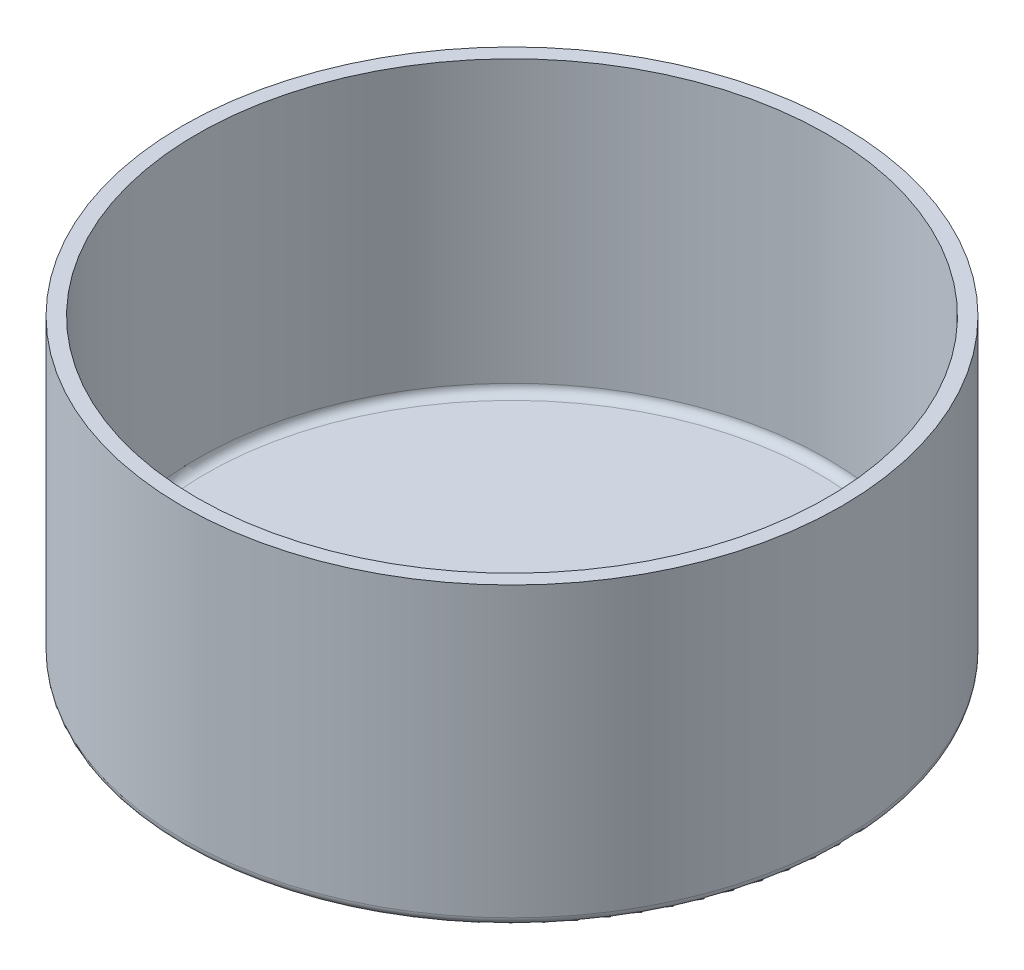
ISO-10303-21;
HEADER;
FILE_DESCRIPTION(('STEP AP214'),'2;1');
FILE_NAME('part.step','',(''),(''),'','','');
FILE_SCHEMA(('AUTOMOTIVE_DESIGN { 1 0 10303 214 1 1 1 1 }'));
ENDSEC;
DATA;
#1=APPLICATION_CONTEXT('core data for automotive mechanical design processes');
#2=APPLICATION_PROTOCOL_DEFINITION('international standard','automotive_design',2000,#1);
#3=PRODUCT_CONTEXT('',#1,'mechanical');
#4=PRODUCT('Part','Part','',(#3));
#5=PRODUCT_RELATED_PRODUCT_CATEGORY('part','',(#4));
#6=PRODUCT_DEFINITION_FORMATION('','',#4);
#7=PRODUCT_DEFINITION_CONTEXT('part definition',#1,'design');
#8=PRODUCT_DEFINITION('design','',#6,#7);
#9=PRODUCT_DEFINITION_SHAPE('','',#8);
#10=(LENGTH_UNIT() NAMED_UNIT(*) SI_UNIT(.MILLI.,.METRE.));
#11=(NAMED_UNIT(*) PLANE_ANGLE_UNIT() SI_UNIT($,.RADIAN.));
#12=(NAMED_UNIT(*) SI_UNIT($,.STERADIAN.) SOLID_ANGLE_UNIT());
#13=UNCERTAINTY_MEASURE_WITH_UNIT(LENGTH_MEASURE(1.E-05),#10,'distance_accuracy_value','');
#14=(GEOMETRIC_REPRESENTATION_CONTEXT(3) GLOBAL_UNCERTAINTY_ASSIGNED_CONTEXT((#13)) GLOBAL_UNIT_ASSIGNED_CONTEXT((#10,
#11,#12)) REPRESENTATION_CONTEXT('',''));
#15=CARTESIAN_POINT('',(0.,0.,0.));
#16=DIRECTION('',(0.,0.,1.));
#17=DIRECTION('',(1.,0.,0.));
#18=AXIS2_PLACEMENT_3D('',#15,#16,#17);
#19=CARTESIAN_POINT('',(0.,0.25,0.));
#20=DIRECTION('',(0.,-1.,0.));
#21=DIRECTION('',(0.,0.,-1.));
#22=AXIS2_PLACEMENT_3D('',#19,#20,#21);
#23=CYLINDRICAL_SURFACE('',#22,11.375);
#24=CARTESIAN_POINT('',(0.,0.3,0.));
#25=DIRECTION('',(0.,1.,0.));
#26=DIRECTION('',(0.,0.,1.));
#27=AXIS2_PLACEMENT_3D('',#24,#25,#26);
#28=CIRCLE('',#27,11.375);
#29=CARTESIAN_POINT('',(0.,0.3,11.375));
#30=VERTEX_POINT('',#29);
#31=EDGE_CURVE('E44',#30,#30,#28,.T.);
#32=ORIENTED_EDGE('',*,*,#31,.T.);
#33=EDGE_LOOP('',(#32));
#34=FACE_BOUND('',#33,.T.);
#35=CARTESIAN_POINT('',(0.,10.25,0.));
#36=DIRECTION('',(0.,1.,0.));
#37=DIRECTION('',(0.,0.,1.));
#38=AXIS2_PLACEMENT_3D('',#35,#36,#37);
#39=CIRCLE('',#38,11.375);
#40=CARTESIAN_POINT('',(0.,10.25,11.375));
#41=VERTEX_POINT('',#40);
#42=EDGE_CURVE('E60',#41,#41,#39,.T.);
#43=ORIENTED_EDGE('',*,*,#42,.F.);
#44=EDGE_LOOP('',(#43));
#45=FACE_BOUND('',#44,.T.);
#46=ADVANCED_FACE('F36',(#34,#45),#23,.T.);
#47=CARTESIAN_POINT('',(0.,0.,0.));
#48=DIRECTION('',(0.,1.,0.));
#49=DIRECTION('',(0.,0.,1.));
#50=AXIS2_PLACEMENT_3D('',#47,#48,#49);
#51=PLANE('',#50);
#52=CARTESIAN_POINT('',(0.,0.,0.));
#53=DIRECTION('',(0.,1.,0.));
#54=DIRECTION('',(0.,0.,1.));
#55=AXIS2_PLACEMENT_3D('',#52,#53,#54);
#56=CIRCLE('',#55,11.075);
#57=CARTESIAN_POINT('',(0.,0.,11.075));
#58=VERTEX_POINT('',#57);
#59=EDGE_CURVE('E10',#58,#58,#56,.F.);
#60=ORIENTED_EDGE('',*,*,#59,.T.);
#61=EDGE_LOOP('',(#60));
#62=FACE_BOUND('',#61,.T.);
#63=ADVANCED_FACE('F73',(#62),#51,.F.);
#64=CARTESIAN_POINT('',(0.,10.25,0.));
#65=DIRECTION('',(0.,1.,0.));
#66=DIRECTION('',(0.,0.,1.));
#67=AXIS2_PLACEMENT_3D('',#64,#65,#66);
#68=PLANE('',#67);
#69=ORIENTED_EDGE('',*,*,#42,.T.);
#70=EDGE_LOOP('',(#69));
#71=FACE_BOUND('',#70,.T.);
#72=CARTESIAN_POINT('',(0.,10.25,0.));
#73=DIRECTION('',(0.,1.,0.));
#74=DIRECTION('',(0.,0.,1.));
#75=AXIS2_PLACEMENT_3D('',#72,#73,#74);
#76=CIRCLE('',#75,10.875);
#77=CARTESIAN_POINT('',(0.,10.25,10.875));
#78=VERTEX_POINT('',#77);
#79=EDGE_CURVE('E64',#78,#78,#76,.T.);
#80=ORIENTED_EDGE('',*,*,#79,.F.);
#81=EDGE_LOOP('',(#80));
#82=FACE_BOUND('',#81,.T.);
#83=ADVANCED_FACE('F71',(#71,#82),#68,.T.);
#84=CARTESIAN_POINT('',(0.,10.25,0.));
#85=DIRECTION('',(0.,-1.,0.));
#86=DIRECTION('',(0.,0.,-1.));
#87=AXIS2_PLACEMENT_3D('',#84,#85,#86);
#88=CYLINDRICAL_SURFACE('',#87,10.875);
#89=CARTESIAN_POINT('',(0.,0.55,0.));
#90=DIRECTION('',(0.,1.,0.));
#91=DIRECTION('',(0.,0.,1.));
#92=AXIS2_PLACEMENT_3D('',#89,#90,#91);
#93=CIRCLE('',#92,10.875);
#94=CARTESIAN_POINT('',(0.,0.55,10.875));
#95=VERTEX_POINT('',#94);
#96=EDGE_CURVE('E54',#95,#95,#93,.F.);
#97=ORIENTED_EDGE('',*,*,#96,.T.);
#98=EDGE_LOOP('',(#97));
#99=FACE_BOUND('',#98,.T.);
#100=ORIENTED_EDGE('',*,*,#79,.T.);
#101=EDGE_LOOP('',(#100));
#102=FACE_BOUND('',#101,.T.);
#103=ADVANCED_FACE('F69',(#99,#102),#88,.F.);
#104=CARTESIAN_POINT('',(0.,0.25,0.));
#105=DIRECTION('',(0.,1.,0.));
#106=DIRECTION('',(0.,0.,1.));
#107=AXIS2_PLACEMENT_3D('',#104,#105,#106);
#108=PLANE('',#107);
#109=CARTESIAN_POINT('',(0.,0.25,0.));
#110=DIRECTION('',(0.,1.,0.));
#111=DIRECTION('',(0.,0.,1.));
#112=AXIS2_PLACEMENT_3D('',#109,#110,#111);
#113=CIRCLE('',#112,10.575);
#114=CARTESIAN_POINT('',(0.,0.25,10.575));
#115=VERTEX_POINT('',#114);
#116=EDGE_CURVE('E49',#115,#115,#113,.T.);
#117=ORIENTED_EDGE('',*,*,#116,.T.);
#118=EDGE_LOOP('',(#117));
#119=FACE_BOUND('',#118,.T.);
#120=ADVANCED_FACE('F80',(#119),#108,.T.);
#121=CARTESIAN_POINT('',(0.,0.55,0.));
#122=DIRECTION('',(0.,1.,0.));
#123=DIRECTION('',(0.,0.,1.));
#124=AXIS2_PLACEMENT_3D('',#121,#122,#123);
#125=TOROIDAL_SURFACE('',#124,10.575,0.3);
#126=ORIENTED_EDGE('',*,*,#116,.F.);
#127=EDGE_LOOP('',(#126));
#128=FACE_BOUND('',#127,.T.);
#129=ORIENTED_EDGE('',*,*,#96,.F.);
#130=EDGE_LOOP('',(#129));
#131=FACE_BOUND('',#130,.T.);
#132=ADVANCED_FACE('F92',(#128,#131),#125,.F.);
#133=CARTESIAN_POINT('',(0.,0.3,0.));
#134=DIRECTION('',(0.,1.,0.));
#135=DIRECTION('',(0.,0.,1.));
#136=AXIS2_PLACEMENT_3D('',#133,#134,#135);
#137=TOROIDAL_SURFACE('',#136,11.075,0.3);
#138=ORIENTED_EDGE('',*,*,#59,.F.);
#139=EDGE_LOOP('',(#138));
#140=FACE_BOUND('',#139,.T.);
#141=ORIENTED_EDGE('',*,*,#31,.F.);
#142=EDGE_LOOP('',(#141));
#143=FACE_BOUND('',#142,.T.);
#144=ADVANCED_FACE('F38',(#140,#143),#137,.T.);
#145=CLOSED_SHELL('',(#46,#63,#83,#103,#120,#132,#144));
#146=MANIFOLD_SOLID_BREP('B2',#145);
#147=ADVANCED_BREP_SHAPE_REPRESENTATION('',(#18,#146),#14);
#148=SHAPE_DEFINITION_REPRESENTATION(#9,#147);
ENDSEC;
END-ISO-10303-21;
